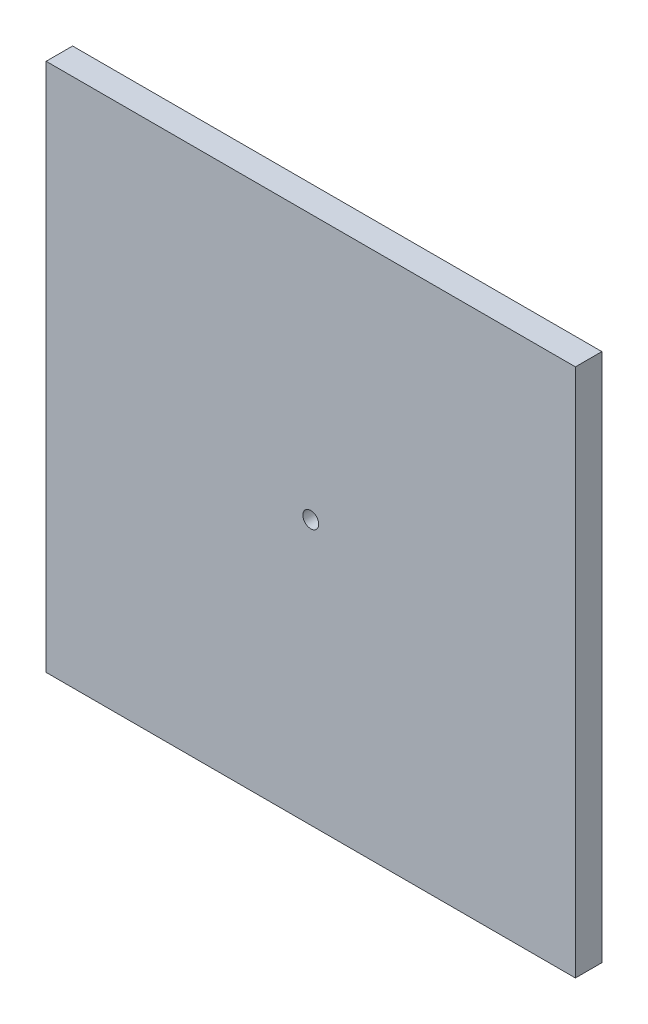
ISO-10303-21;
HEADER;
FILE_DESCRIPTION(('STEP AP214'),'2;1');
FILE_NAME('part.step','',(''),(''),'','','');
FILE_SCHEMA(('AUTOMOTIVE_DESIGN { 1 0 10303 214 1 1 1 1 }'));
ENDSEC;
DATA;
#1=APPLICATION_CONTEXT('core data for automotive mechanical design processes');
#2=APPLICATION_PROTOCOL_DEFINITION('international standard','automotive_design',2000,#1);
#3=PRODUCT_CONTEXT('',#1,'mechanical');
#4=PRODUCT('Part','Part','',(#3));
#5=PRODUCT_RELATED_PRODUCT_CATEGORY('part','',(#4));
#6=PRODUCT_DEFINITION_FORMATION('','',#4);
#7=PRODUCT_DEFINITION_CONTEXT('part definition',#1,'design');
#8=PRODUCT_DEFINITION('design','',#6,#7);
#9=PRODUCT_DEFINITION_SHAPE('','',#8);
#10=(LENGTH_UNIT() NAMED_UNIT(*) SI_UNIT(.MILLI.,.METRE.));
#11=(NAMED_UNIT(*) PLANE_ANGLE_UNIT() SI_UNIT($,.RADIAN.));
#12=(NAMED_UNIT(*) SI_UNIT($,.STERADIAN.) SOLID_ANGLE_UNIT());
#13=UNCERTAINTY_MEASURE_WITH_UNIT(LENGTH_MEASURE(1.E-05),#10,'distance_accuracy_value','');
#14=(GEOMETRIC_REPRESENTATION_CONTEXT(3) GLOBAL_UNCERTAINTY_ASSIGNED_CONTEXT((#13)) GLOBAL_UNIT_ASSIGNED_CONTEXT((#10,
#11,#12)) REPRESENTATION_CONTEXT('',''));
#15=CARTESIAN_POINT('',(0.,0.,0.));
#16=DIRECTION('',(0.,0.,1.));
#17=DIRECTION('',(1.,0.,0.));
#18=AXIS2_PLACEMENT_3D('',#15,#16,#17);
#19=CARTESIAN_POINT('',(0.,0.,5.));
#20=DIRECTION('',(0.,0.,1.));
#21=DIRECTION('',(1.,0.,0.));
#22=AXIS2_PLACEMENT_3D('',#19,#20,#21);
#23=PLANE('',#22);
#24=DIRECTION('',(0.,-1.,0.));
#25=VECTOR('',#24,1.);
#26=CARTESIAN_POINT('',(-50.,50.,5.));
#27=LINE('',#26,#25);
#28=CARTESIAN_POINT('',(-50.,50.,5.));
#29=VERTEX_POINT('',#28);
#30=CARTESIAN_POINT('',(-50.,-50.,5.));
#31=VERTEX_POINT('',#30);
#32=EDGE_CURVE('E86',#29,#31,#27,.T.);
#33=ORIENTED_EDGE('',*,*,#32,.T.);
#34=DIRECTION('',(1.,0.,0.));
#35=VECTOR('',#34,1.);
#36=CARTESIAN_POINT('',(-50.,-50.,5.));
#37=LINE('',#36,#35);
#38=CARTESIAN_POINT('',(50.,-50.,5.));
#39=VERTEX_POINT('',#38);
#40=EDGE_CURVE('E81',#31,#39,#37,.T.);
#41=ORIENTED_EDGE('',*,*,#40,.T.);
#42=DIRECTION('',(0.,1.,0.));
#43=VECTOR('',#42,1.);
#44=CARTESIAN_POINT('',(50.,50.,5.));
#45=LINE('',#44,#43);
#46=CARTESIAN_POINT('',(50.,50.,5.));
#47=VERTEX_POINT('',#46);
#48=EDGE_CURVE('E84',#39,#47,#45,.T.);
#49=ORIENTED_EDGE('',*,*,#48,.T.);
#50=DIRECTION('',(-1.,0.,0.));
#51=VECTOR('',#50,1.);
#52=CARTESIAN_POINT('',(-50.,50.,5.));
#53=LINE('',#52,#51);
#54=EDGE_CURVE('E51',#47,#29,#53,.T.);
#55=ORIENTED_EDGE('',*,*,#54,.T.);
#56=EDGE_LOOP('',(#33,#41,#49,#55));
#57=FACE_BOUND('',#56,.T.);
#58=CARTESIAN_POINT('',(0.,0.,5.));
#59=DIRECTION('',(0.,0.,1.));
#60=DIRECTION('',(1.,0.,0.));
#61=AXIS2_PLACEMENT_3D('',#58,#59,#60);
#62=CIRCLE('',#61,1.5);
#63=CARTESIAN_POINT('',(1.5,0.,5.));
#64=VERTEX_POINT('',#63);
#65=EDGE_CURVE('E101',#64,#64,#62,.T.);
#66=ORIENTED_EDGE('',*,*,#65,.F.);
#67=EDGE_LOOP('',(#66));
#68=FACE_BOUND('',#67,.T.);
#69=ADVANCED_FACE('F34',(#57,#68),#23,.T.);
#70=CARTESIAN_POINT('',(0.,0.,0.));
#71=DIRECTION('',(0.,0.,1.));
#72=DIRECTION('',(1.,0.,0.));
#73=AXIS2_PLACEMENT_3D('',#70,#71,#72);
#74=PLANE('',#73);
#75=DIRECTION('',(0.,-1.,0.));
#76=VECTOR('',#75,1.);
#77=CARTESIAN_POINT('',(-50.,50.,0.));
#78=LINE('',#77,#76);
#79=CARTESIAN_POINT('',(-50.,50.,0.));
#80=VERTEX_POINT('',#79);
#81=CARTESIAN_POINT('',(-50.,-50.,0.));
#82=VERTEX_POINT('',#81);
#83=EDGE_CURVE('E98',#80,#82,#78,.T.);
#84=ORIENTED_EDGE('',*,*,#83,.F.);
#85=DIRECTION('',(-1.,0.,0.));
#86=VECTOR('',#85,1.);
#87=CARTESIAN_POINT('',(-50.,50.,0.));
#88=LINE('',#87,#86);
#89=CARTESIAN_POINT('',(50.,50.,0.));
#90=VERTEX_POINT('',#89);
#91=EDGE_CURVE('E74',#90,#80,#88,.T.);
#92=ORIENTED_EDGE('',*,*,#91,.F.);
#93=DIRECTION('',(0.,1.,0.));
#94=VECTOR('',#93,1.);
#95=CARTESIAN_POINT('',(50.,50.,0.));
#96=LINE('',#95,#94);
#97=CARTESIAN_POINT('',(50.,-50.,0.));
#98=VERTEX_POINT('',#97);
#99=EDGE_CURVE('E68',#98,#90,#96,.T.);
#100=ORIENTED_EDGE('',*,*,#99,.F.);
#101=DIRECTION('',(1.,0.,0.));
#102=VECTOR('',#101,1.);
#103=CARTESIAN_POINT('',(-50.,-50.,0.));
#104=LINE('',#103,#102);
#105=EDGE_CURVE('E90',#82,#98,#104,.T.);
#106=ORIENTED_EDGE('',*,*,#105,.F.);
#107=EDGE_LOOP('',(#84,#92,#100,#106));
#108=FACE_BOUND('',#107,.T.);
#109=CARTESIAN_POINT('',(0.,0.,0.));
#110=DIRECTION('',(0.,0.,1.));
#111=DIRECTION('',(1.,0.,0.));
#112=AXIS2_PLACEMENT_3D('',#109,#110,#111);
#113=CIRCLE('',#112,1.5);
#114=CARTESIAN_POINT('',(1.5,0.,0.));
#115=VERTEX_POINT('',#114);
#116=EDGE_CURVE('E113',#115,#115,#113,.T.);
#117=ORIENTED_EDGE('',*,*,#116,.T.);
#118=EDGE_LOOP('',(#117));
#119=FACE_BOUND('',#118,.T.);
#120=ADVANCED_FACE('F109',(#108,#119),#74,.F.);
#121=CARTESIAN_POINT('',(-50.,50.,5.));
#122=DIRECTION('',(1.,0.,0.));
#123=DIRECTION('',(0.,1.,0.));
#124=AXIS2_PLACEMENT_3D('',#121,#122,#123);
#125=PLANE('',#124);
#126=ORIENTED_EDGE('',*,*,#83,.T.);
#127=DIRECTION('',(0.,0.,-1.));
#128=VECTOR('',#127,1.);
#129=CARTESIAN_POINT('',(-50.,-50.,5.));
#130=LINE('',#129,#128);
#131=EDGE_CURVE('E11',#31,#82,#130,.T.);
#132=ORIENTED_EDGE('',*,*,#131,.F.);
#133=ORIENTED_EDGE('',*,*,#32,.F.);
#134=DIRECTION('',(0.,0.,-1.));
#135=VECTOR('',#134,1.);
#136=CARTESIAN_POINT('',(-50.,50.,5.));
#137=LINE('',#136,#135);
#138=EDGE_CURVE('E94',#29,#80,#137,.T.);
#139=ORIENTED_EDGE('',*,*,#138,.T.);
#140=EDGE_LOOP('',(#126,#132,#133,#139));
#141=FACE_BOUND('',#140,.T.);
#142=ADVANCED_FACE('F36',(#141),#125,.F.);
#143=CARTESIAN_POINT('',(-50.,-50.,5.));
#144=DIRECTION('',(0.,1.,0.));
#145=DIRECTION('',(0.,0.,1.));
#146=AXIS2_PLACEMENT_3D('',#143,#144,#145);
#147=PLANE('',#146);
#148=ORIENTED_EDGE('',*,*,#105,.T.);
#149=DIRECTION('',(0.,0.,-1.));
#150=VECTOR('',#149,1.);
#151=CARTESIAN_POINT('',(50.,-50.,5.));
#152=LINE('',#151,#150);
#153=EDGE_CURVE('E43',#39,#98,#152,.T.);
#154=ORIENTED_EDGE('',*,*,#153,.F.);
#155=ORIENTED_EDGE('',*,*,#40,.F.);
#156=ORIENTED_EDGE('',*,*,#131,.T.);
#157=EDGE_LOOP('',(#148,#154,#155,#156));
#158=FACE_BOUND('',#157,.T.);
#159=ADVANCED_FACE('F89',(#158),#147,.F.);
#160=CARTESIAN_POINT('',(50.,50.,5.));
#161=DIRECTION('',(-1.,0.,0.));
#162=DIRECTION('',(0.,-1.,0.));
#163=AXIS2_PLACEMENT_3D('',#160,#161,#162);
#164=PLANE('',#163);
#165=ORIENTED_EDGE('',*,*,#99,.T.);
#166=DIRECTION('',(0.,0.,-1.));
#167=VECTOR('',#166,1.);
#168=CARTESIAN_POINT('',(50.,50.,5.));
#169=LINE('',#168,#167);
#170=EDGE_CURVE('E91',#47,#90,#169,.T.);
#171=ORIENTED_EDGE('',*,*,#170,.F.);
#172=ORIENTED_EDGE('',*,*,#48,.F.);
#173=ORIENTED_EDGE('',*,*,#153,.T.);
#174=EDGE_LOOP('',(#165,#171,#172,#173));
#175=FACE_BOUND('',#174,.T.);
#176=ADVANCED_FACE('F92',(#175),#164,.F.);
#177=CARTESIAN_POINT('',(-50.,50.,5.));
#178=DIRECTION('',(0.,-1.,0.));
#179=DIRECTION('',(0.,0.,-1.));
#180=AXIS2_PLACEMENT_3D('',#177,#178,#179);
#181=PLANE('',#180);
#182=ORIENTED_EDGE('',*,*,#91,.T.);
#183=ORIENTED_EDGE('',*,*,#138,.F.);
#184=ORIENTED_EDGE('',*,*,#54,.F.);
#185=ORIENTED_EDGE('',*,*,#170,.T.);
#186=EDGE_LOOP('',(#182,#183,#184,#185));
#187=FACE_BOUND('',#186,.T.);
#188=ADVANCED_FACE('F106',(#187),#181,.F.);
#189=CARTESIAN_POINT('',(0.,0.,5.));
#190=DIRECTION('',(0.,0.,-1.));
#191=DIRECTION('',(-1.,0.,0.));
#192=AXIS2_PLACEMENT_3D('',#189,#190,#191);
#193=CYLINDRICAL_SURFACE('',#192,1.5);
#194=ORIENTED_EDGE('',*,*,#65,.T.);
#195=EDGE_LOOP('',(#194));
#196=FACE_BOUND('',#195,.T.);
#197=ORIENTED_EDGE('',*,*,#116,.F.);
#198=EDGE_LOOP('',(#197));
#199=FACE_BOUND('',#198,.T.);
#200=ADVANCED_FACE('F119',(#196,#199),#193,.F.);
#201=CLOSED_SHELL('',(#69,#120,#142,#159,#176,#188,#200));
#202=MANIFOLD_SOLID_BREP('B2',#201);
#203=ADVANCED_BREP_SHAPE_REPRESENTATION('',(#18,#202),#14);
#204=SHAPE_DEFINITION_REPRESENTATION(#9,#203);
ENDSEC;
END-ISO-10303-21;
